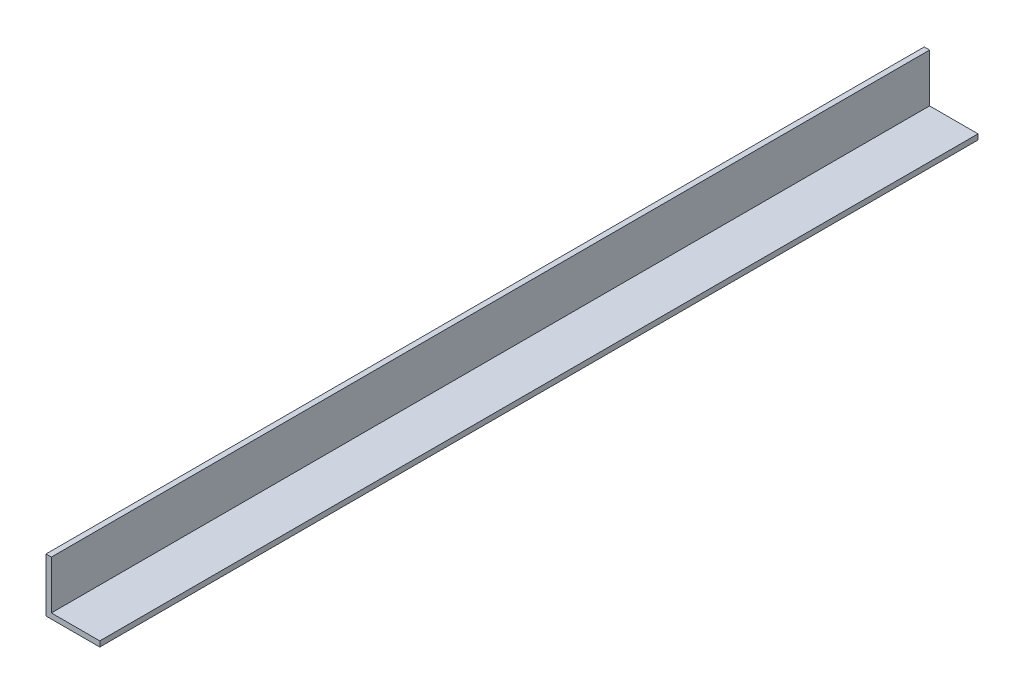
ISO-10303-21;
HEADER;
FILE_DESCRIPTION(('STEP AP214'),'2;1');
FILE_NAME('part.step','',(''),(''),'','','');
FILE_SCHEMA(('AUTOMOTIVE_DESIGN { 1 0 10303 214 1 1 1 1 }'));
ENDSEC;
DATA;
#1=APPLICATION_CONTEXT('core data for automotive mechanical design processes');
#2=APPLICATION_PROTOCOL_DEFINITION('international standard','automotive_design',2000,#1);
#3=PRODUCT_CONTEXT('',#1,'mechanical');
#4=PRODUCT('Part','Part','',(#3));
#5=PRODUCT_RELATED_PRODUCT_CATEGORY('part','',(#4));
#6=PRODUCT_DEFINITION_FORMATION('','',#4);
#7=PRODUCT_DEFINITION_CONTEXT('part definition',#1,'design');
#8=PRODUCT_DEFINITION('design','',#6,#7);
#9=PRODUCT_DEFINITION_SHAPE('','',#8);
#10=(LENGTH_UNIT() NAMED_UNIT(*) SI_UNIT(.MILLI.,.METRE.));
#11=(NAMED_UNIT(*) PLANE_ANGLE_UNIT() SI_UNIT($,.RADIAN.));
#12=(NAMED_UNIT(*) SI_UNIT($,.STERADIAN.) SOLID_ANGLE_UNIT());
#13=UNCERTAINTY_MEASURE_WITH_UNIT(LENGTH_MEASURE(1.E-05),#10,'distance_accuracy_value','');
#14=(GEOMETRIC_REPRESENTATION_CONTEXT(3) GLOBAL_UNCERTAINTY_ASSIGNED_CONTEXT((#13)) GLOBAL_UNIT_ASSIGNED_CONTEXT((#10,
#11,#12)) REPRESENTATION_CONTEXT('',''));
#15=CARTESIAN_POINT('',(0.,0.,0.));
#16=DIRECTION('',(0.,0.,1.));
#17=DIRECTION('',(1.,0.,0.));
#18=AXIS2_PLACEMENT_3D('',#15,#16,#17);
#19=CARTESIAN_POINT('',(30.,0.,490.));
#20=DIRECTION('',(0.,1.,0.));
#21=DIRECTION('',(-1.,0.,0.));
#22=AXIS2_PLACEMENT_3D('',#19,#20,#21);
#23=PLANE('',#22);
#24=DIRECTION('',(1.,0.,0.));
#25=VECTOR('',#24,1.);
#26=CARTESIAN_POINT('',(30.,0.,0.));
#27=LINE('',#26,#25);
#28=CARTESIAN_POINT('',(0.,0.,0.));
#29=VERTEX_POINT('',#28);
#30=CARTESIAN_POINT('',(30.,0.,0.));
#31=VERTEX_POINT('',#30);
#32=EDGE_CURVE('E118',#29,#31,#27,.T.);
#33=ORIENTED_EDGE('',*,*,#32,.T.);
#34=DIRECTION('',(0.,0.,-1.));
#35=VECTOR('',#34,1.);
#36=CARTESIAN_POINT('',(30.,0.,490.));
#37=LINE('',#36,#35);
#38=CARTESIAN_POINT('',(30.,0.,490.));
#39=VERTEX_POINT('',#38);
#40=EDGE_CURVE('E11',#39,#31,#37,.T.);
#41=ORIENTED_EDGE('',*,*,#40,.F.);
#42=DIRECTION('',(1.,0.,0.));
#43=VECTOR('',#42,1.);
#44=CARTESIAN_POINT('',(30.,0.,490.));
#45=LINE('',#44,#43);
#46=CARTESIAN_POINT('',(0.,0.,490.));
#47=VERTEX_POINT('',#46);
#48=EDGE_CURVE('E128',#47,#39,#45,.T.);
#49=ORIENTED_EDGE('',*,*,#48,.F.);
#50=DIRECTION('',(0.,0.,-1.));
#51=VECTOR('',#50,1.);
#52=CARTESIAN_POINT('',(0.,0.,490.));
#53=LINE('',#52,#51);
#54=EDGE_CURVE('E114',#47,#29,#53,.T.);
#55=ORIENTED_EDGE('',*,*,#54,.T.);
#56=EDGE_LOOP('',(#33,#41,#49,#55));
#57=FACE_BOUND('',#56,.T.);
#58=ADVANCED_FACE('F34',(#57),#23,.F.);
#59=CARTESIAN_POINT('',(30.,3.,490.));
#60=DIRECTION('',(-1.,0.,0.));
#61=DIRECTION('',(0.,0.,1.));
#62=AXIS2_PLACEMENT_3D('',#59,#60,#61);
#63=PLANE('',#62);
#64=DIRECTION('',(0.,1.,0.));
#65=VECTOR('',#64,1.);
#66=CARTESIAN_POINT('',(30.,3.,0.));
#67=LINE('',#66,#65);
#68=CARTESIAN_POINT('',(30.,3.,0.));
#69=VERTEX_POINT('',#68);
#70=EDGE_CURVE('E121',#31,#69,#67,.T.);
#71=ORIENTED_EDGE('',*,*,#70,.T.);
#72=DIRECTION('',(0.,0.,-1.));
#73=VECTOR('',#72,1.);
#74=CARTESIAN_POINT('',(30.,3.,490.));
#75=LINE('',#74,#73);
#76=CARTESIAN_POINT('',(30.,3.,490.));
#77=VERTEX_POINT('',#76);
#78=EDGE_CURVE('E42',#77,#69,#75,.T.);
#79=ORIENTED_EDGE('',*,*,#78,.F.);
#80=DIRECTION('',(0.,1.,0.));
#81=VECTOR('',#80,1.);
#82=CARTESIAN_POINT('',(30.,3.,490.));
#83=LINE('',#82,#81);
#84=EDGE_CURVE('E87',#39,#77,#83,.T.);
#85=ORIENTED_EDGE('',*,*,#84,.F.);
#86=ORIENTED_EDGE('',*,*,#40,.T.);
#87=EDGE_LOOP('',(#71,#79,#85,#86));
#88=FACE_BOUND('',#87,.T.);
#89=ADVANCED_FACE('F152',(#88),#63,.F.);
#90=CARTESIAN_POINT('',(3.00000000000001,3.,490.));
#91=DIRECTION('',(0.,-1.,0.));
#92=DIRECTION('',(1.,0.,0.));
#93=AXIS2_PLACEMENT_3D('',#90,#91,#92);
#94=PLANE('',#93);
#95=DIRECTION('',(-1.,0.,0.));
#96=VECTOR('',#95,1.);
#97=CARTESIAN_POINT('',(3.00000000000001,3.,0.));
#98=LINE('',#97,#96);
#99=CARTESIAN_POINT('',(3.00000000000001,3.,0.));
#100=VERTEX_POINT('',#99);
#101=EDGE_CURVE('E123',#69,#100,#98,.T.);
#102=ORIENTED_EDGE('',*,*,#101,.T.);
#103=DIRECTION('',(0.,0.,-1.));
#104=VECTOR('',#103,1.);
#105=CARTESIAN_POINT('',(3.00000000000001,3.,490.));
#106=LINE('',#105,#104);
#107=CARTESIAN_POINT('',(3.00000000000001,3.,490.));
#108=VERTEX_POINT('',#107);
#109=EDGE_CURVE('E109',#108,#100,#106,.T.);
#110=ORIENTED_EDGE('',*,*,#109,.F.);
#111=DIRECTION('',(-1.,0.,0.));
#112=VECTOR('',#111,1.);
#113=CARTESIAN_POINT('',(3.00000000000001,3.,490.));
#114=LINE('',#113,#112);
#115=EDGE_CURVE('E100',#77,#108,#114,.T.);
#116=ORIENTED_EDGE('',*,*,#115,.F.);
#117=ORIENTED_EDGE('',*,*,#78,.T.);
#118=EDGE_LOOP('',(#102,#110,#116,#117));
#119=FACE_BOUND('',#118,.T.);
#120=ADVANCED_FACE('F134',(#119),#94,.F.);
#121=CARTESIAN_POINT('',(3.,30.,490.));
#122=DIRECTION('',(-1.,0.,0.));
#123=DIRECTION('',(0.,-1.,0.));
#124=AXIS2_PLACEMENT_3D('',#121,#122,#123);
#125=PLANE('',#124);
#126=DIRECTION('',(0.,1.,0.));
#127=VECTOR('',#126,1.);
#128=CARTESIAN_POINT('',(3.,30.,0.));
#129=LINE('',#128,#127);
#130=CARTESIAN_POINT('',(3.,30.,0.));
#131=VERTEX_POINT('',#130);
#132=EDGE_CURVE('E108',#100,#131,#129,.T.);
#133=ORIENTED_EDGE('',*,*,#132,.T.);
#134=DIRECTION('',(0.,0.,-1.));
#135=VECTOR('',#134,1.);
#136=CARTESIAN_POINT('',(3.,30.,490.));
#137=LINE('',#136,#135);
#138=CARTESIAN_POINT('',(3.,30.,490.));
#139=VERTEX_POINT('',#138);
#140=EDGE_CURVE('E105',#139,#131,#137,.T.);
#141=ORIENTED_EDGE('',*,*,#140,.F.);
#142=DIRECTION('',(0.,1.,0.));
#143=VECTOR('',#142,1.);
#144=CARTESIAN_POINT('',(3.,30.,490.));
#145=LINE('',#144,#143);
#146=EDGE_CURVE('E94',#108,#139,#145,.T.);
#147=ORIENTED_EDGE('',*,*,#146,.F.);
#148=ORIENTED_EDGE('',*,*,#109,.T.);
#149=EDGE_LOOP('',(#133,#141,#147,#148));
#150=FACE_BOUND('',#149,.T.);
#151=ADVANCED_FACE('F106',(#150),#125,.F.);
#152=CARTESIAN_POINT('',(0.,30.,490.));
#153=DIRECTION('',(0.,-1.,0.));
#154=DIRECTION('',(0.,0.,-1.));
#155=AXIS2_PLACEMENT_3D('',#152,#153,#154);
#156=PLANE('',#155);
#157=DIRECTION('',(-1.,0.,0.));
#158=VECTOR('',#157,1.);
#159=CARTESIAN_POINT('',(0.,30.,0.));
#160=LINE('',#159,#158);
#161=CARTESIAN_POINT('',(0.,30.,0.));
#162=VERTEX_POINT('',#161);
#163=EDGE_CURVE('E73',#131,#162,#160,.T.);
#164=ORIENTED_EDGE('',*,*,#163,.T.);
#165=DIRECTION('',(0.,0.,-1.));
#166=VECTOR('',#165,1.);
#167=CARTESIAN_POINT('',(0.,30.,490.));
#168=LINE('',#167,#166);
#169=CARTESIAN_POINT('',(0.,30.,490.));
#170=VERTEX_POINT('',#169);
#171=EDGE_CURVE('E110',#170,#162,#168,.T.);
#172=ORIENTED_EDGE('',*,*,#171,.F.);
#173=DIRECTION('',(-1.,0.,0.));
#174=VECTOR('',#173,1.);
#175=CARTESIAN_POINT('',(0.,30.,490.));
#176=LINE('',#175,#174);
#177=EDGE_CURVE('E98',#139,#170,#176,.T.);
#178=ORIENTED_EDGE('',*,*,#177,.F.);
#179=ORIENTED_EDGE('',*,*,#140,.T.);
#180=EDGE_LOOP('',(#164,#172,#178,#179));
#181=FACE_BOUND('',#180,.T.);
#182=ADVANCED_FACE('F112',(#181),#156,.F.);
#183=CARTESIAN_POINT('',(0.,0.,490.));
#184=DIRECTION('',(1.,0.,0.));
#185=DIRECTION('',(0.,0.,-1.));
#186=AXIS2_PLACEMENT_3D('',#183,#184,#185);
#187=PLANE('',#186);
#188=DIRECTION('',(0.,-1.,0.));
#189=VECTOR('',#188,1.);
#190=CARTESIAN_POINT('',(0.,0.,0.));
#191=LINE('',#190,#189);
#192=EDGE_CURVE('E79',#162,#29,#191,.T.);
#193=ORIENTED_EDGE('',*,*,#192,.T.);
#194=ORIENTED_EDGE('',*,*,#54,.F.);
#195=DIRECTION('',(0.,-1.,0.));
#196=VECTOR('',#195,1.);
#197=CARTESIAN_POINT('',(0.,0.,490.));
#198=LINE('',#197,#196);
#199=EDGE_CURVE('E50',#170,#47,#198,.T.);
#200=ORIENTED_EDGE('',*,*,#199,.F.);
#201=ORIENTED_EDGE('',*,*,#171,.T.);
#202=EDGE_LOOP('',(#193,#194,#200,#201));
#203=FACE_BOUND('',#202,.T.);
#204=ADVANCED_FACE('F141',(#203),#187,.F.);
#205=CARTESIAN_POINT('',(0.,0.,490.));
#206=DIRECTION('',(0.,0.,-1.));
#207=DIRECTION('',(-1.,0.,0.));
#208=AXIS2_PLACEMENT_3D('',#205,#206,#207);
#209=PLANE('',#208);
#210=ORIENTED_EDGE('',*,*,#48,.T.);
#211=ORIENTED_EDGE('',*,*,#84,.T.);
#212=ORIENTED_EDGE('',*,*,#115,.T.);
#213=ORIENTED_EDGE('',*,*,#146,.T.);
#214=ORIENTED_EDGE('',*,*,#177,.T.);
#215=ORIENTED_EDGE('',*,*,#199,.T.);
#216=EDGE_LOOP('',(#210,#211,#212,#213,#214,#215));
#217=FACE_BOUND('',#216,.T.);
#218=ADVANCED_FACE('F96',(#217),#209,.F.);
#219=CARTESIAN_POINT('',(0.,0.,0.));
#220=DIRECTION('',(0.,0.,-1.));
#221=DIRECTION('',(-1.,0.,0.));
#222=AXIS2_PLACEMENT_3D('',#219,#220,#221);
#223=PLANE('',#222);
#224=ORIENTED_EDGE('',*,*,#32,.F.);
#225=ORIENTED_EDGE('',*,*,#192,.F.);
#226=ORIENTED_EDGE('',*,*,#163,.F.);
#227=ORIENTED_EDGE('',*,*,#132,.F.);
#228=ORIENTED_EDGE('',*,*,#101,.F.);
#229=ORIENTED_EDGE('',*,*,#70,.F.);
#230=EDGE_LOOP('',(#224,#225,#226,#227,#228,#229));
#231=FACE_BOUND('',#230,.T.);
#232=ADVANCED_FACE('F137',(#231),#223,.T.);
#233=CLOSED_SHELL('',(#58,#89,#120,#151,#182,#204,#218,#232));
#234=MANIFOLD_SOLID_BREP('B2',#233);
#235=ADVANCED_BREP_SHAPE_REPRESENTATION('',(#18,#234),#14);
#236=SHAPE_DEFINITION_REPRESENTATION(#9,#235);
ENDSEC;
END-ISO-10303-21;
